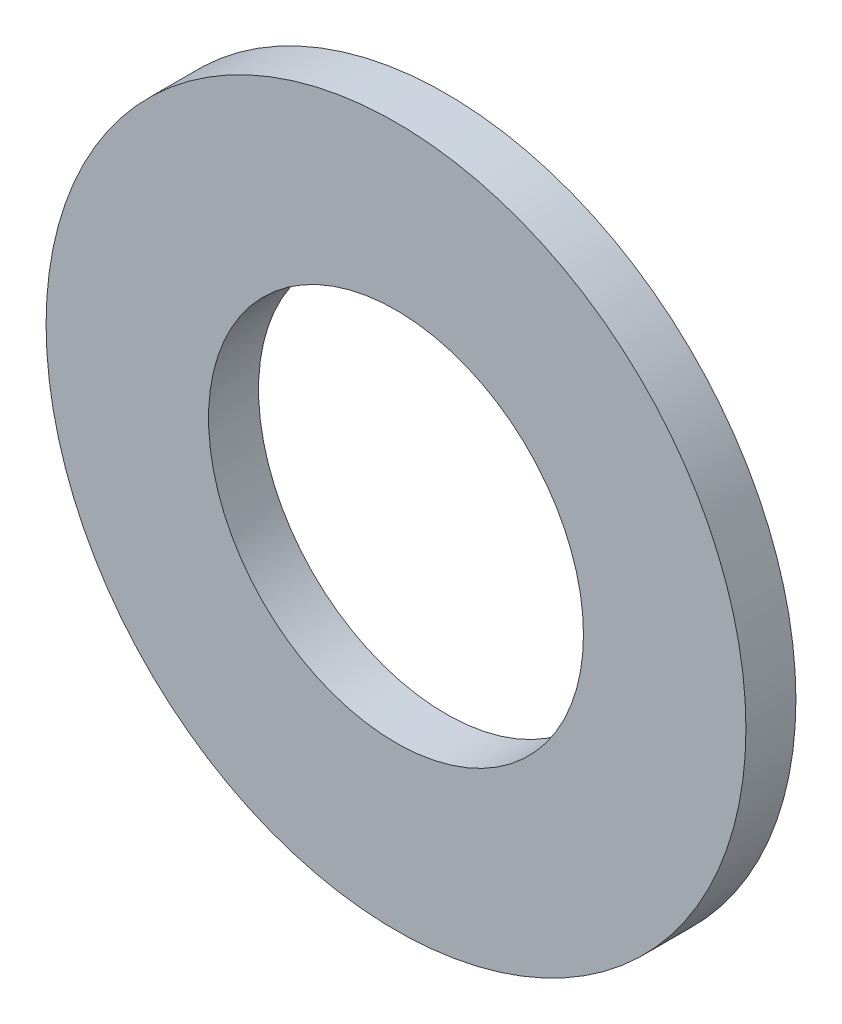
ISO-10303-21;
HEADER;
FILE_DESCRIPTION(('STEP AP214'),'2;1');
FILE_NAME('part.step','',(''),(''),'','','');
FILE_SCHEMA(('AUTOMOTIVE_DESIGN { 1 0 10303 214 1 1 1 1 }'));
ENDSEC;
DATA;
#1=APPLICATION_CONTEXT('core data for automotive mechanical design processes');
#2=APPLICATION_PROTOCOL_DEFINITION('international standard','automotive_design',2000,#1);
#3=PRODUCT_CONTEXT('',#1,'mechanical');
#4=PRODUCT('Part','Part','',(#3));
#5=PRODUCT_RELATED_PRODUCT_CATEGORY('part','',(#4));
#6=PRODUCT_DEFINITION_FORMATION('','',#4);
#7=PRODUCT_DEFINITION_CONTEXT('part definition',#1,'design');
#8=PRODUCT_DEFINITION('design','',#6,#7);
#9=PRODUCT_DEFINITION_SHAPE('','',#8);
#10=(LENGTH_UNIT() NAMED_UNIT(*) SI_UNIT(.MILLI.,.METRE.));
#11=(NAMED_UNIT(*) PLANE_ANGLE_UNIT() SI_UNIT($,.RADIAN.));
#12=(NAMED_UNIT(*) SI_UNIT($,.STERADIAN.) SOLID_ANGLE_UNIT());
#13=UNCERTAINTY_MEASURE_WITH_UNIT(LENGTH_MEASURE(1.E-05),#10,'distance_accuracy_value','');
#14=(GEOMETRIC_REPRESENTATION_CONTEXT(3) GLOBAL_UNCERTAINTY_ASSIGNED_CONTEXT((#13)) GLOBAL_UNIT_ASSIGNED_CONTEXT((#10,
#11,#12)) REPRESENTATION_CONTEXT('',''));
#15=CARTESIAN_POINT('',(0.,0.,0.));
#16=DIRECTION('',(0.,0.,1.));
#17=DIRECTION('',(1.,0.,0.));
#18=AXIS2_PLACEMENT_3D('',#15,#16,#17);
#19=CARTESIAN_POINT('',(0.,0.,0.));
#20=DIRECTION('',(0.,0.,-1.));
#21=DIRECTION('',(-1.,0.,0.));
#22=AXIS2_PLACEMENT_3D('',#19,#20,#21);
#23=PLANE('',#22);
#24=CARTESIAN_POINT('',(0.,0.,0.));
#25=DIRECTION('',(0.,0.,1.));
#26=DIRECTION('',(1.,0.,0.));
#27=AXIS2_PLACEMENT_3D('',#24,#25,#26);
#28=CIRCLE('',#27,11.906);
#29=CARTESIAN_POINT('',(11.906,0.,0.));
#30=VERTEX_POINT('',#29);
#31=EDGE_CURVE('E46',#30,#30,#28,.T.);
#32=ORIENTED_EDGE('',*,*,#31,.F.);
#33=EDGE_LOOP('',(#32));
#34=FACE_BOUND('',#33,.T.);
#35=CARTESIAN_POINT('',(0.,0.,0.));
#36=DIRECTION('',(0.,0.,1.));
#37=DIRECTION('',(1.,0.,0.));
#38=AXIS2_PLACEMENT_3D('',#35,#36,#37);
#39=CIRCLE('',#38,22.225);
#40=CARTESIAN_POINT('',(22.225,0.,0.));
#41=VERTEX_POINT('',#40);
#42=EDGE_CURVE('E10',#41,#41,#39,.T.);
#43=ORIENTED_EDGE('',*,*,#42,.T.);
#44=EDGE_LOOP('',(#43));
#45=FACE_BOUND('',#44,.T.);
#46=ADVANCED_FACE('F32',(#34,#45),#23,.F.);
#47=CARTESIAN_POINT('',(0.,0.,5.38458166943201E-12));
#48=DIRECTION('',(0.,0.,1.));
#49=DIRECTION('',(1.,0.,0.));
#50=AXIS2_PLACEMENT_3D('',#47,#48,#49);
#51=CYLINDRICAL_SURFACE('',#50,22.225);
#52=ORIENTED_EDGE('',*,*,#42,.F.);
#53=EDGE_LOOP('',(#52));
#54=FACE_BOUND('',#53,.T.);
#55=CARTESIAN_POINT('',(0.,0.,-3.17500000000001));
#56=DIRECTION('',(0.,0.,1.));
#57=DIRECTION('',(1.,0.,0.));
#58=AXIS2_PLACEMENT_3D('',#55,#56,#57);
#59=CIRCLE('',#58,22.225);
#60=CARTESIAN_POINT('',(22.225,0.,-3.17500000000001));
#61=VERTEX_POINT('',#60);
#62=EDGE_CURVE('E38',#61,#61,#59,.T.);
#63=ORIENTED_EDGE('',*,*,#62,.T.);
#64=EDGE_LOOP('',(#63));
#65=FACE_BOUND('',#64,.T.);
#66=ADVANCED_FACE('F56',(#54,#65),#51,.T.);
#67=CARTESIAN_POINT('',(0.,22.225,-3.17500000000001));
#68=DIRECTION('',(0.,0.,1.));
#69=DIRECTION('',(1.,0.,0.));
#70=AXIS2_PLACEMENT_3D('',#67,#68,#69);
#71=PLANE('',#70);
#72=CARTESIAN_POINT('',(0.,0.,-3.17500000000001));
#73=DIRECTION('',(0.,0.,1.));
#74=DIRECTION('',(1.,0.,0.));
#75=AXIS2_PLACEMENT_3D('',#72,#73,#74);
#76=CIRCLE('',#75,11.906);
#77=CARTESIAN_POINT('',(11.906,0.,-3.17500000000001));
#78=VERTEX_POINT('',#77);
#79=EDGE_CURVE('E42',#78,#78,#76,.F.);
#80=ORIENTED_EDGE('',*,*,#79,.F.);
#81=EDGE_LOOP('',(#80));
#82=FACE_BOUND('',#81,.T.);
#83=ORIENTED_EDGE('',*,*,#62,.F.);
#84=EDGE_LOOP('',(#83));
#85=FACE_BOUND('',#84,.T.);
#86=ADVANCED_FACE('F60',(#82,#85),#71,.F.);
#87=CARTESIAN_POINT('',(0.,0.,-3.17600000000001));
#88=DIRECTION('',(0.,0.,1.));
#89=DIRECTION('',(1.,0.,0.));
#90=AXIS2_PLACEMENT_3D('',#87,#88,#89);
#91=CYLINDRICAL_SURFACE('',#90,11.906);
#92=ORIENTED_EDGE('',*,*,#31,.T.);
#93=EDGE_LOOP('',(#92));
#94=FACE_BOUND('',#93,.T.);
#95=ORIENTED_EDGE('',*,*,#79,.T.);
#96=EDGE_LOOP('',(#95));
#97=FACE_BOUND('',#96,.T.);
#98=ADVANCED_FACE('F52',(#94,#97),#91,.F.);
#99=CLOSED_SHELL('',(#46,#66,#86,#98));
#100=MANIFOLD_SOLID_BREP('B2',#99);
#101=ADVANCED_BREP_SHAPE_REPRESENTATION('',(#18,#100),#14);
#102=SHAPE_DEFINITION_REPRESENTATION(#9,#101);
ENDSEC;
END-ISO-10303-21;
